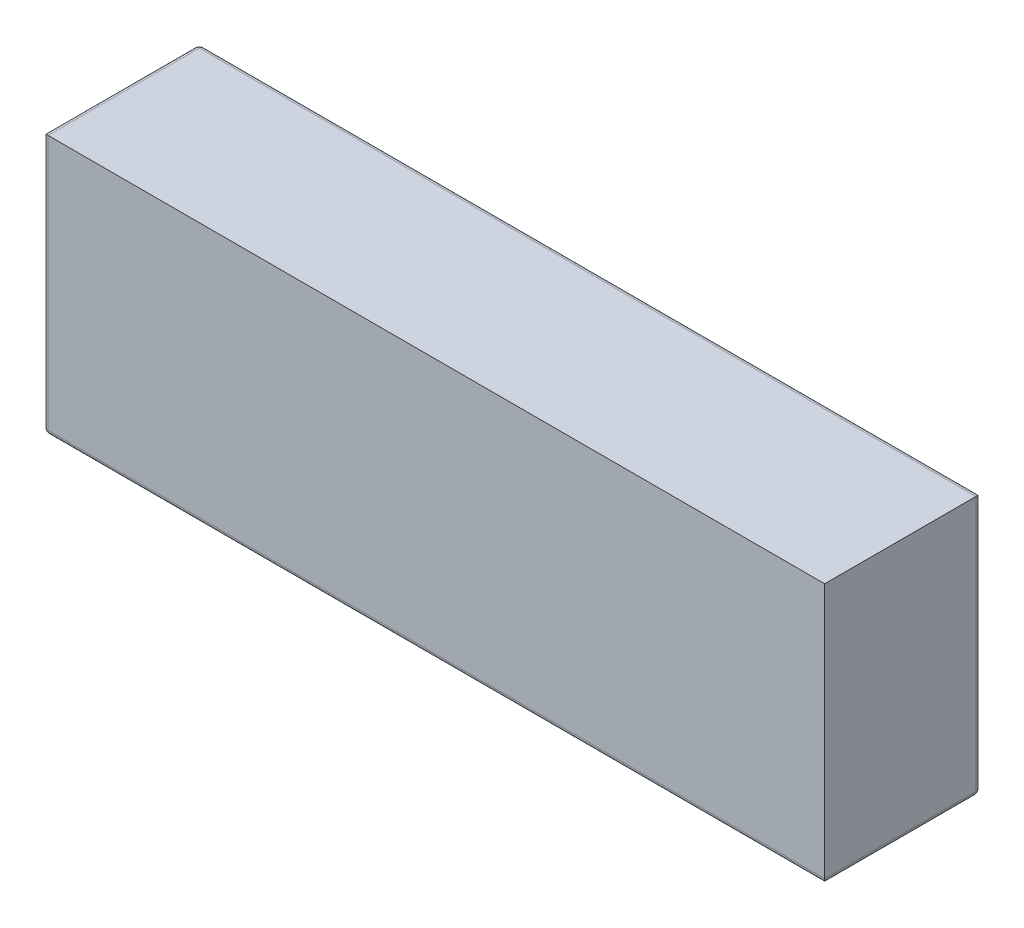
ISO-10303-21;
HEADER;
FILE_DESCRIPTION(('STEP AP214'),'2;1');
FILE_NAME('part.step','',(''),(''),'','','');
FILE_SCHEMA(('AUTOMOTIVE_DESIGN { 1 0 10303 214 1 1 1 1 }'));
ENDSEC;
DATA;
#1=APPLICATION_CONTEXT('core data for automotive mechanical design processes');
#2=APPLICATION_PROTOCOL_DEFINITION('international standard','automotive_design',2000,#1);
#3=PRODUCT_CONTEXT('',#1,'mechanical');
#4=PRODUCT('Part','Part','',(#3));
#5=PRODUCT_RELATED_PRODUCT_CATEGORY('part','',(#4));
#6=PRODUCT_DEFINITION_FORMATION('','',#4);
#7=PRODUCT_DEFINITION_CONTEXT('part definition',#1,'design');
#8=PRODUCT_DEFINITION('design','',#6,#7);
#9=PRODUCT_DEFINITION_SHAPE('','',#8);
#10=(LENGTH_UNIT() NAMED_UNIT(*) SI_UNIT(.MILLI.,.METRE.));
#11=(NAMED_UNIT(*) PLANE_ANGLE_UNIT() SI_UNIT($,.RADIAN.));
#12=(NAMED_UNIT(*) SI_UNIT($,.STERADIAN.) SOLID_ANGLE_UNIT());
#13=UNCERTAINTY_MEASURE_WITH_UNIT(LENGTH_MEASURE(1.E-05),#10,'distance_accuracy_value','');
#14=(GEOMETRIC_REPRESENTATION_CONTEXT(3) GLOBAL_UNCERTAINTY_ASSIGNED_CONTEXT((#13)) GLOBAL_UNIT_ASSIGNED_CONTEXT((#10,
#11,#12)) REPRESENTATION_CONTEXT('',''));
#15=CARTESIAN_POINT('',(0.,0.,0.));
#16=DIRECTION('',(0.,0.,1.));
#17=DIRECTION('',(1.,0.,0.));
#18=AXIS2_PLACEMENT_3D('',#15,#16,#17);
#19=CARTESIAN_POINT('',(75.,25.,28.));
#20=DIRECTION('',(-1.,0.,0.));
#21=DIRECTION('',(0.,0.,1.));
#22=AXIS2_PLACEMENT_3D('',#19,#20,#21);
#23=PLANE('',#22);
#24=DIRECTION('',(0.,1.,0.));
#25=VECTOR('',#24,1.);
#26=CARTESIAN_POINT('',(75.,25.,29.));
#27=LINE('',#26,#25);
#28=CARTESIAN_POINT('',(75.,-24.,29.));
#29=VERTEX_POINT('',#28);
#30=CARTESIAN_POINT('',(75.,25.,29.));
#31=VERTEX_POINT('',#30);
#32=EDGE_CURVE('E115',#29,#31,#27,.T.);
#33=ORIENTED_EDGE('',*,*,#32,.F.);
#34=DIRECTION('',(0.,0.,-1.));
#35=VECTOR('',#34,1.);
#36=CARTESIAN_POINT('',(75.,-24.,28.));
#37=LINE('',#36,#35);
#38=CARTESIAN_POINT('',(75.,-24.,0.));
#39=VERTEX_POINT('',#38);
#40=EDGE_CURVE('E160',#29,#39,#37,.T.);
#41=ORIENTED_EDGE('',*,*,#40,.T.);
#42=DIRECTION('',(0.,-1.,0.));
#43=VECTOR('',#42,1.);
#44=CARTESIAN_POINT('',(75.,25.,0.));
#45=LINE('',#44,#43);
#46=CARTESIAN_POINT('',(75.,25.,0.));
#47=VERTEX_POINT('',#46);
#48=EDGE_CURVE('E128',#39,#47,#45,.F.);
#49=ORIENTED_EDGE('',*,*,#48,.T.);
#50=DIRECTION('',(0.,0.,-1.));
#51=VECTOR('',#50,1.);
#52=CARTESIAN_POINT('',(75.,25.,28.));
#53=LINE('',#52,#51);
#54=EDGE_CURVE('E126',#31,#47,#53,.T.);
#55=ORIENTED_EDGE('',*,*,#54,.F.);
#56=EDGE_LOOP('',(#33,#41,#49,#55));
#57=FACE_BOUND('',#56,.T.);
#58=ADVANCED_FACE('F42',(#57),#23,.F.);
#59=CARTESIAN_POINT('',(-75.,25.,28.));
#60=DIRECTION('',(0.,-1.,0.));
#61=DIRECTION('',(0.,0.,-1.));
#62=AXIS2_PLACEMENT_3D('',#59,#60,#61);
#63=PLANE('',#62);
#64=DIRECTION('',(1.,0.,0.));
#65=VECTOR('',#64,1.);
#66=CARTESIAN_POINT('',(-75.,25.,0.));
#67=LINE('',#66,#65);
#68=CARTESIAN_POINT('',(-74.,25.,0.));
#69=VERTEX_POINT('',#68);
#70=EDGE_CURVE('E147',#47,#69,#67,.F.);
#71=ORIENTED_EDGE('',*,*,#70,.T.);
#72=DIRECTION('',(0.,0.,-1.));
#73=VECTOR('',#72,1.);
#74=CARTESIAN_POINT('',(-74.,25.,28.));
#75=LINE('',#74,#73);
#76=CARTESIAN_POINT('',(-74.,25.,29.));
#77=VERTEX_POINT('',#76);
#78=EDGE_CURVE('E136',#69,#77,#75,.F.);
#79=ORIENTED_EDGE('',*,*,#78,.T.);
#80=DIRECTION('',(-1.,0.,0.));
#81=VECTOR('',#80,1.);
#82=CARTESIAN_POINT('',(-75.,25.,29.));
#83=LINE('',#82,#81);
#84=EDGE_CURVE('E119',#31,#77,#83,.T.);
#85=ORIENTED_EDGE('',*,*,#84,.F.);
#86=ORIENTED_EDGE('',*,*,#54,.T.);
#87=EDGE_LOOP('',(#71,#79,#85,#86));
#88=FACE_BOUND('',#87,.T.);
#89=ADVANCED_FACE('F134',(#88),#63,.F.);
#90=CARTESIAN_POINT('',(-75.,25.,28.));
#91=DIRECTION('',(1.,0.,0.));
#92=DIRECTION('',(0.,1.,0.));
#93=AXIS2_PLACEMENT_3D('',#90,#91,#92);
#94=PLANE('',#93);
#95=DIRECTION('',(0.,0.,-1.));
#96=VECTOR('',#95,1.);
#97=CARTESIAN_POINT('',(-75.,-24.,28.));
#98=LINE('',#97,#96);
#99=CARTESIAN_POINT('',(-75.,-24.,0.));
#100=VERTEX_POINT('',#99);
#101=CARTESIAN_POINT('',(-75.,-24.,28.));
#102=VERTEX_POINT('',#101);
#103=EDGE_CURVE('E140',#100,#102,#98,.F.);
#104=ORIENTED_EDGE('',*,*,#103,.T.);
#105=DIRECTION('',(0.,-1.,0.));
#106=VECTOR('',#105,1.);
#107=CARTESIAN_POINT('',(-75.,25.,28.));
#108=LINE('',#107,#106);
#109=CARTESIAN_POINT('',(-75.,24.,28.));
#110=VERTEX_POINT('',#109);
#111=EDGE_CURVE('E145',#102,#110,#108,.F.);
#112=ORIENTED_EDGE('',*,*,#111,.T.);
#113=DIRECTION('',(0.,0.,-1.));
#114=VECTOR('',#113,1.);
#115=CARTESIAN_POINT('',(-75.,24.,28.));
#116=LINE('',#115,#114);
#117=CARTESIAN_POINT('',(-75.,24.,0.));
#118=VERTEX_POINT('',#117);
#119=EDGE_CURVE('E142',#110,#118,#116,.T.);
#120=ORIENTED_EDGE('',*,*,#119,.T.);
#121=DIRECTION('',(0.,1.,0.));
#122=VECTOR('',#121,1.);
#123=CARTESIAN_POINT('',(-75.,-25.,0.));
#124=LINE('',#123,#122);
#125=EDGE_CURVE('E131',#118,#100,#124,.F.);
#126=ORIENTED_EDGE('',*,*,#125,.T.);
#127=EDGE_LOOP('',(#104,#112,#120,#126));
#128=FACE_BOUND('',#127,.T.);
#129=ADVANCED_FACE('F235',(#128),#94,.F.);
#130=CARTESIAN_POINT('',(-75.,-25.,28.));
#131=DIRECTION('',(0.,1.,0.));
#132=DIRECTION('',(0.,0.,1.));
#133=AXIS2_PLACEMENT_3D('',#130,#131,#132);
#134=PLANE('',#133);
#135=DIRECTION('',(0.,0.,-1.));
#136=VECTOR('',#135,1.);
#137=CARTESIAN_POINT('',(74.,-25.,28.));
#138=LINE('',#137,#136);
#139=CARTESIAN_POINT('',(74.,-25.,0.));
#140=VERTEX_POINT('',#139);
#141=CARTESIAN_POINT('',(74.,-25.,28.));
#142=VERTEX_POINT('',#141);
#143=EDGE_CURVE('E152',#140,#142,#138,.F.);
#144=ORIENTED_EDGE('',*,*,#143,.T.);
#145=DIRECTION('',(1.,0.,0.));
#146=VECTOR('',#145,1.);
#147=CARTESIAN_POINT('',(-75.,-25.,28.));
#148=LINE('',#147,#146);
#149=CARTESIAN_POINT('',(-74.,-25.,28.));
#150=VERTEX_POINT('',#149);
#151=EDGE_CURVE('E157',#142,#150,#148,.F.);
#152=ORIENTED_EDGE('',*,*,#151,.T.);
#153=DIRECTION('',(0.,0.,-1.));
#154=VECTOR('',#153,1.);
#155=CARTESIAN_POINT('',(-74.,-25.,28.));
#156=LINE('',#155,#154);
#157=CARTESIAN_POINT('',(-74.,-25.,0.));
#158=VERTEX_POINT('',#157);
#159=EDGE_CURVE('E154',#150,#158,#156,.T.);
#160=ORIENTED_EDGE('',*,*,#159,.T.);
#161=DIRECTION('',(-1.,0.,0.));
#162=VECTOR('',#161,1.);
#163=CARTESIAN_POINT('',(75.,-25.,0.));
#164=LINE('',#163,#162);
#165=EDGE_CURVE('E150',#158,#140,#164,.F.);
#166=ORIENTED_EDGE('',*,*,#165,.T.);
#167=EDGE_LOOP('',(#144,#152,#160,#166));
#168=FACE_BOUND('',#167,.T.);
#169=ADVANCED_FACE('F253',(#168),#134,.F.);
#170=CARTESIAN_POINT('',(0.,0.,29.));
#171=DIRECTION('',(0.,0.,1.));
#172=DIRECTION('',(1.,0.,0.));
#173=AXIS2_PLACEMENT_3D('',#170,#171,#172);
#174=PLANE('',#173);
#175=DIRECTION('',(0.,-1.,0.));
#176=VECTOR('',#175,1.);
#177=CARTESIAN_POINT('',(-74.,-25.,29.));
#178=LINE('',#177,#176);
#179=CARTESIAN_POINT('',(-74.,-24.,29.));
#180=VERTEX_POINT('',#179);
#181=EDGE_CURVE('E162',#77,#180,#178,.T.);
#182=ORIENTED_EDGE('',*,*,#181,.T.);
#183=DIRECTION('',(1.,0.,0.));
#184=VECTOR('',#183,1.);
#185=CARTESIAN_POINT('',(75.,-24.,29.));
#186=LINE('',#185,#184);
#187=EDGE_CURVE('E121',#180,#29,#186,.T.);
#188=ORIENTED_EDGE('',*,*,#187,.T.);
#189=ORIENTED_EDGE('',*,*,#32,.T.);
#190=ORIENTED_EDGE('',*,*,#84,.T.);
#191=EDGE_LOOP('',(#182,#188,#189,#190));
#192=FACE_BOUND('',#191,.T.);
#193=ADVANCED_FACE('F117',(#192),#174,.T.);
#194=CARTESIAN_POINT('',(0.,0.,-1.));
#195=DIRECTION('',(0.,0.,-1.));
#196=DIRECTION('',(-1.,0.,0.));
#197=AXIS2_PLACEMENT_3D('',#194,#195,#196);
#198=PLANE('',#197);
#199=DIRECTION('',(0.,-1.,0.));
#200=VECTOR('',#199,1.);
#201=CARTESIAN_POINT('',(74.,-25.,-1.));
#202=LINE('',#201,#200);
#203=CARTESIAN_POINT('',(74.,24.,-1.));
#204=VERTEX_POINT('',#203);
#205=CARTESIAN_POINT('',(74.,-24.,-1.));
#206=VERTEX_POINT('',#205);
#207=EDGE_CURVE('E51',#204,#206,#202,.T.);
#208=ORIENTED_EDGE('',*,*,#207,.T.);
#209=DIRECTION('',(-1.,0.,0.));
#210=VECTOR('',#209,1.);
#211=CARTESIAN_POINT('',(-75.,-24.,-1.));
#212=LINE('',#211,#210);
#213=CARTESIAN_POINT('',(-74.,-24.,-1.));
#214=VERTEX_POINT('',#213);
#215=EDGE_CURVE('E11',#206,#214,#212,.T.);
#216=ORIENTED_EDGE('',*,*,#215,.T.);
#217=DIRECTION('',(0.,1.,0.));
#218=VECTOR('',#217,1.);
#219=CARTESIAN_POINT('',(-74.,25.,-1.));
#220=LINE('',#219,#218);
#221=CARTESIAN_POINT('',(-74.,24.,-1.));
#222=VERTEX_POINT('',#221);
#223=EDGE_CURVE('E165',#214,#222,#220,.T.);
#224=ORIENTED_EDGE('',*,*,#223,.T.);
#225=DIRECTION('',(1.,0.,0.));
#226=VECTOR('',#225,1.);
#227=CARTESIAN_POINT('',(75.,24.,-1.));
#228=LINE('',#227,#226);
#229=EDGE_CURVE('E62',#222,#204,#228,.T.);
#230=ORIENTED_EDGE('',*,*,#229,.T.);
#231=EDGE_LOOP('',(#208,#216,#224,#230));
#232=FACE_BOUND('',#231,.T.);
#233=ADVANCED_FACE('F258',(#232),#198,.T.);
#234=CARTESIAN_POINT('',(74.,-24.,28.));
#235=DIRECTION('',(0.,0.,-1.));
#236=DIRECTION('',(-1.,0.,0.));
#237=AXIS2_PLACEMENT_3D('',#234,#235,#236);
#238=CYLINDRICAL_SURFACE('',#237,1.);
#239=CARTESIAN_POINT('',(74.,-24.,28.));
#240=DIRECTION('',(-0.707106781186547,0.,0.707106781186547));
#241=DIRECTION('',(-0.707106781186547,0.,-0.707106781186547));
#242=AXIS2_PLACEMENT_3D('',#239,#240,#241);
#243=ELLIPSE('',#242,1.41421356237309,1.);
#244=EDGE_CURVE('E202',#142,#29,#243,.T.);
#245=ORIENTED_EDGE('',*,*,#244,.F.);
#246=ORIENTED_EDGE('',*,*,#143,.F.);
#247=CARTESIAN_POINT('',(74.,-24.,0.));
#248=DIRECTION('',(0.,0.,-1.));
#249=DIRECTION('',(-1.,0.,0.));
#250=AXIS2_PLACEMENT_3D('',#247,#248,#249);
#251=CIRCLE('',#250,1.);
#252=EDGE_CURVE('E204',#39,#140,#251,.T.);
#253=ORIENTED_EDGE('',*,*,#252,.F.);
#254=ORIENTED_EDGE('',*,*,#40,.F.);
#255=EDGE_LOOP('',(#245,#246,#253,#254));
#256=FACE_BOUND('',#255,.T.);
#257=ADVANCED_FACE('F44',(#256),#238,.T.);
#258=CARTESIAN_POINT('',(0.,-24.,0.));
#259=DIRECTION('',(1.,0.,0.));
#260=DIRECTION('',(0.,0.,-1.));
#261=AXIS2_PLACEMENT_3D('',#258,#259,#260);
#262=CYLINDRICAL_SURFACE('',#261,1.);
#263=CARTESIAN_POINT('',(74.,-24.,0.));
#264=DIRECTION('',(1.,0.,0.));
#265=DIRECTION('',(0.,0.,-1.));
#266=AXIS2_PLACEMENT_3D('',#263,#264,#265);
#267=CIRCLE('',#266,1.);
#268=EDGE_CURVE('E46',#140,#206,#267,.T.);
#269=ORIENTED_EDGE('',*,*,#268,.F.);
#270=ORIENTED_EDGE('',*,*,#165,.F.);
#271=CARTESIAN_POINT('',(-74.,-24.,0.));
#272=DIRECTION('',(-1.,0.,0.));
#273=DIRECTION('',(0.,-1.,0.));
#274=AXIS2_PLACEMENT_3D('',#271,#272,#273);
#275=CIRCLE('',#274,1.);
#276=EDGE_CURVE('E197',#214,#158,#275,.T.);
#277=ORIENTED_EDGE('',*,*,#276,.F.);
#278=ORIENTED_EDGE('',*,*,#215,.F.);
#279=EDGE_LOOP('',(#269,#270,#277,#278));
#280=FACE_BOUND('',#279,.T.);
#281=ADVANCED_FACE('F257',(#280),#262,.T.);
#282=CARTESIAN_POINT('',(74.,-24.,0.));
#283=DIRECTION('',(0.,-1.,0.));
#284=DIRECTION('',(0.,0.,-1.));
#285=AXIS2_PLACEMENT_3D('',#282,#283,#284);
#286=SPHERICAL_SURFACE('',#285,1.);
#287=ORIENTED_EDGE('',*,*,#252,.T.);
#288=ORIENTED_EDGE('',*,*,#268,.T.);
#289=CARTESIAN_POINT('',(74.,-24.,0.));
#290=DIRECTION('',(0.,-1.,0.));
#291=DIRECTION('',(0.,0.,-1.));
#292=AXIS2_PLACEMENT_3D('',#289,#290,#291);
#293=CIRCLE('',#292,1.);
#294=EDGE_CURVE('E194',#39,#206,#293,.F.);
#295=ORIENTED_EDGE('',*,*,#294,.F.);
#296=EDGE_LOOP('',(#287,#288,#295));
#297=FACE_BOUND('',#296,.T.);
#298=ADVANCED_FACE('F211',(#297),#286,.T.);
#299=CARTESIAN_POINT('',(0.,-24.,28.));
#300=DIRECTION('',(-1.,0.,0.));
#301=DIRECTION('',(0.,0.,1.));
#302=AXIS2_PLACEMENT_3D('',#299,#300,#301);
#303=CYLINDRICAL_SURFACE('',#302,1.);
#304=ORIENTED_EDGE('',*,*,#244,.T.);
#305=ORIENTED_EDGE('',*,*,#187,.F.);
#306=CARTESIAN_POINT('',(-74.,-24.,28.));
#307=DIRECTION('',(-1.,0.,0.));
#308=DIRECTION('',(0.,0.,1.));
#309=AXIS2_PLACEMENT_3D('',#306,#307,#308);
#310=CIRCLE('',#309,1.);
#311=EDGE_CURVE('E191',#150,#180,#310,.T.);
#312=ORIENTED_EDGE('',*,*,#311,.F.);
#313=ORIENTED_EDGE('',*,*,#151,.F.);
#314=EDGE_LOOP('',(#304,#305,#312,#313));
#315=FACE_BOUND('',#314,.T.);
#316=ADVANCED_FACE('F243',(#315),#303,.T.);
#317=CARTESIAN_POINT('',(-74.,-24.,28.));
#318=DIRECTION('',(0.,0.,-1.));
#319=DIRECTION('',(-1.,0.,0.));
#320=AXIS2_PLACEMENT_3D('',#317,#318,#319);
#321=CYLINDRICAL_SURFACE('',#320,1.);
#322=CARTESIAN_POINT('',(-74.,-24.,0.));
#323=DIRECTION('',(0.,0.,-1.));
#324=DIRECTION('',(-1.,0.,0.));
#325=AXIS2_PLACEMENT_3D('',#322,#323,#324);
#326=CIRCLE('',#325,1.);
#327=EDGE_CURVE('E199',#158,#100,#326,.T.);
#328=ORIENTED_EDGE('',*,*,#327,.F.);
#329=ORIENTED_EDGE('',*,*,#159,.F.);
#330=CARTESIAN_POINT('',(-74.,-24.,28.));
#331=DIRECTION('',(0.,0.,1.));
#332=DIRECTION('',(1.,0.,0.));
#333=AXIS2_PLACEMENT_3D('',#330,#331,#332);
#334=CIRCLE('',#333,1.);
#335=EDGE_CURVE('E188',#102,#150,#334,.T.);
#336=ORIENTED_EDGE('',*,*,#335,.F.);
#337=ORIENTED_EDGE('',*,*,#103,.F.);
#338=EDGE_LOOP('',(#328,#329,#336,#337));
#339=FACE_BOUND('',#338,.T.);
#340=ADVANCED_FACE('F251',(#339),#321,.T.);
#341=CARTESIAN_POINT('',(-74.,-24.,0.));
#342=DIRECTION('',(0.,-1.,0.));
#343=DIRECTION('',(0.,0.,-1.));
#344=AXIS2_PLACEMENT_3D('',#341,#342,#343);
#345=SPHERICAL_SURFACE('',#344,1.);
#346=ORIENTED_EDGE('',*,*,#276,.T.);
#347=ORIENTED_EDGE('',*,*,#327,.T.);
#348=CARTESIAN_POINT('',(-74.,-24.,0.));
#349=DIRECTION('',(0.,-1.,0.));
#350=DIRECTION('',(0.,0.,-1.));
#351=AXIS2_PLACEMENT_3D('',#348,#349,#350);
#352=CIRCLE('',#351,1.);
#353=EDGE_CURVE('E185',#214,#100,#352,.F.);
#354=ORIENTED_EDGE('',*,*,#353,.F.);
#355=EDGE_LOOP('',(#346,#347,#354));
#356=FACE_BOUND('',#355,.T.);
#357=ADVANCED_FACE('F287',(#356),#345,.T.);
#358=CARTESIAN_POINT('',(74.,0.,0.));
#359=DIRECTION('',(0.,1.,0.));
#360=DIRECTION('',(0.,0.,1.));
#361=AXIS2_PLACEMENT_3D('',#358,#359,#360);
#362=CYLINDRICAL_SURFACE('',#361,1.);
#363=ORIENTED_EDGE('',*,*,#294,.T.);
#364=ORIENTED_EDGE('',*,*,#207,.F.);
#365=CARTESIAN_POINT('',(74.,24.,0.));
#366=DIRECTION('',(-0.707106781186547,0.707106781186547,0.));
#367=DIRECTION('',(-0.707106781186547,-0.707106781186547,0.));
#368=AXIS2_PLACEMENT_3D('',#365,#366,#367);
#369=ELLIPSE('',#368,1.41421356237309,1.);
#370=EDGE_CURVE('E182',#47,#204,#369,.T.);
#371=ORIENTED_EDGE('',*,*,#370,.F.);
#372=ORIENTED_EDGE('',*,*,#48,.F.);
#373=EDGE_LOOP('',(#363,#364,#371,#372));
#374=FACE_BOUND('',#373,.T.);
#375=ADVANCED_FACE('F215',(#374),#362,.T.);
#376=CARTESIAN_POINT('',(-74.,-24.,28.));
#377=DIRECTION('',(0.,-1.,0.));
#378=DIRECTION('',(0.,0.,-1.));
#379=AXIS2_PLACEMENT_3D('',#376,#377,#378);
#380=SPHERICAL_SURFACE('',#379,1.);
#381=ORIENTED_EDGE('',*,*,#335,.T.);
#382=ORIENTED_EDGE('',*,*,#311,.T.);
#383=CARTESIAN_POINT('',(-74.,-24.,28.));
#384=DIRECTION('',(0.,-1.,0.));
#385=DIRECTION('',(0.,0.,-1.));
#386=AXIS2_PLACEMENT_3D('',#383,#384,#385);
#387=CIRCLE('',#386,1.);
#388=EDGE_CURVE('E179',#102,#180,#387,.F.);
#389=ORIENTED_EDGE('',*,*,#388,.F.);
#390=EDGE_LOOP('',(#381,#382,#389));
#391=FACE_BOUND('',#390,.T.);
#392=ADVANCED_FACE('F247',(#391),#380,.T.);
#393=CARTESIAN_POINT('',(-74.,0.,0.));
#394=DIRECTION('',(0.,-1.,0.));
#395=DIRECTION('',(1.,0.,0.));
#396=AXIS2_PLACEMENT_3D('',#393,#394,#395);
#397=CYLINDRICAL_SURFACE('',#396,1.);
#398=ORIENTED_EDGE('',*,*,#353,.T.);
#399=ORIENTED_EDGE('',*,*,#125,.F.);
#400=CARTESIAN_POINT('',(-74.,24.,0.));
#401=DIRECTION('',(0.,1.,0.));
#402=DIRECTION('',(0.,0.,1.));
#403=AXIS2_PLACEMENT_3D('',#400,#401,#402);
#404=CIRCLE('',#403,1.);
#405=EDGE_CURVE('E176',#222,#118,#404,.T.);
#406=ORIENTED_EDGE('',*,*,#405,.F.);
#407=ORIENTED_EDGE('',*,*,#223,.F.);
#408=EDGE_LOOP('',(#398,#399,#406,#407));
#409=FACE_BOUND('',#408,.T.);
#410=ADVANCED_FACE('F231',(#409),#397,.T.);
#411=CARTESIAN_POINT('',(0.,24.,0.));
#412=DIRECTION('',(-1.,0.,0.));
#413=DIRECTION('',(0.,0.,1.));
#414=AXIS2_PLACEMENT_3D('',#411,#412,#413);
#415=CYLINDRICAL_SURFACE('',#414,1.);
#416=ORIENTED_EDGE('',*,*,#370,.T.);
#417=ORIENTED_EDGE('',*,*,#229,.F.);
#418=CARTESIAN_POINT('',(-74.,24.,0.));
#419=DIRECTION('',(-1.,0.,0.));
#420=DIRECTION('',(0.,0.,1.));
#421=AXIS2_PLACEMENT_3D('',#418,#419,#420);
#422=CIRCLE('',#421,1.);
#423=EDGE_CURVE('E173',#69,#222,#422,.T.);
#424=ORIENTED_EDGE('',*,*,#423,.F.);
#425=ORIENTED_EDGE('',*,*,#70,.F.);
#426=EDGE_LOOP('',(#416,#417,#424,#425));
#427=FACE_BOUND('',#426,.T.);
#428=ADVANCED_FACE('F219',(#427),#415,.T.);
#429=CARTESIAN_POINT('',(-74.,0.,28.));
#430=DIRECTION('',(0.,1.,0.));
#431=DIRECTION('',(-1.,0.,0.));
#432=AXIS2_PLACEMENT_3D('',#429,#430,#431);
#433=CYLINDRICAL_SURFACE('',#432,1.);
#434=ORIENTED_EDGE('',*,*,#388,.T.);
#435=ORIENTED_EDGE('',*,*,#181,.F.);
#436=CARTESIAN_POINT('',(-74.,24.,28.));
#437=DIRECTION('',(0.,0.707106781186547,-0.707106781186547));
#438=DIRECTION('',(0.,0.707106781186547,0.707106781186547));
#439=AXIS2_PLACEMENT_3D('',#436,#437,#438);
#440=ELLIPSE('',#439,1.41421356237309,1.);
#441=EDGE_CURVE('E171',#110,#77,#440,.T.);
#442=ORIENTED_EDGE('',*,*,#441,.F.);
#443=ORIENTED_EDGE('',*,*,#111,.F.);
#444=EDGE_LOOP('',(#434,#435,#442,#443));
#445=FACE_BOUND('',#444,.T.);
#446=ADVANCED_FACE('F239',(#445),#433,.T.);
#447=CARTESIAN_POINT('',(-74.,24.,0.));
#448=DIRECTION('',(0.,0.,-1.));
#449=DIRECTION('',(-1.,0.,0.));
#450=AXIS2_PLACEMENT_3D('',#447,#448,#449);
#451=SPHERICAL_SURFACE('',#450,1.);
#452=ORIENTED_EDGE('',*,*,#423,.T.);
#453=ORIENTED_EDGE('',*,*,#405,.T.);
#454=CARTESIAN_POINT('',(-74.,24.,0.));
#455=DIRECTION('',(0.,0.,-1.));
#456=DIRECTION('',(-1.,0.,0.));
#457=AXIS2_PLACEMENT_3D('',#454,#455,#456);
#458=CIRCLE('',#457,1.);
#459=EDGE_CURVE('E169',#69,#118,#458,.F.);
#460=ORIENTED_EDGE('',*,*,#459,.F.);
#461=EDGE_LOOP('',(#452,#453,#460));
#462=FACE_BOUND('',#461,.T.);
#463=ADVANCED_FACE('F228',(#462),#451,.T.);
#464=CARTESIAN_POINT('',(-74.,24.,28.));
#465=DIRECTION('',(0.,0.,-1.));
#466=DIRECTION('',(-1.,0.,0.));
#467=AXIS2_PLACEMENT_3D('',#464,#465,#466);
#468=CYLINDRICAL_SURFACE('',#467,1.);
#469=ORIENTED_EDGE('',*,*,#441,.T.);
#470=ORIENTED_EDGE('',*,*,#78,.F.);
#471=ORIENTED_EDGE('',*,*,#459,.T.);
#472=ORIENTED_EDGE('',*,*,#119,.F.);
#473=EDGE_LOOP('',(#469,#470,#471,#472));
#474=FACE_BOUND('',#473,.T.);
#475=ADVANCED_FACE('F224',(#474),#468,.T.);
#476=CLOSED_SHELL('',(#58,#89,#129,#169,#193,#233,#257,#281,#298,#316,#340,#357,#375,#392,#410,
#428,#446,#463,#475));
#477=MANIFOLD_SOLID_BREP('B2',#476);
#478=ADVANCED_BREP_SHAPE_REPRESENTATION('',(#18,#477),#14);
#479=SHAPE_DEFINITION_REPRESENTATION(#9,#478);
ENDSEC;
END-ISO-10303-21;
